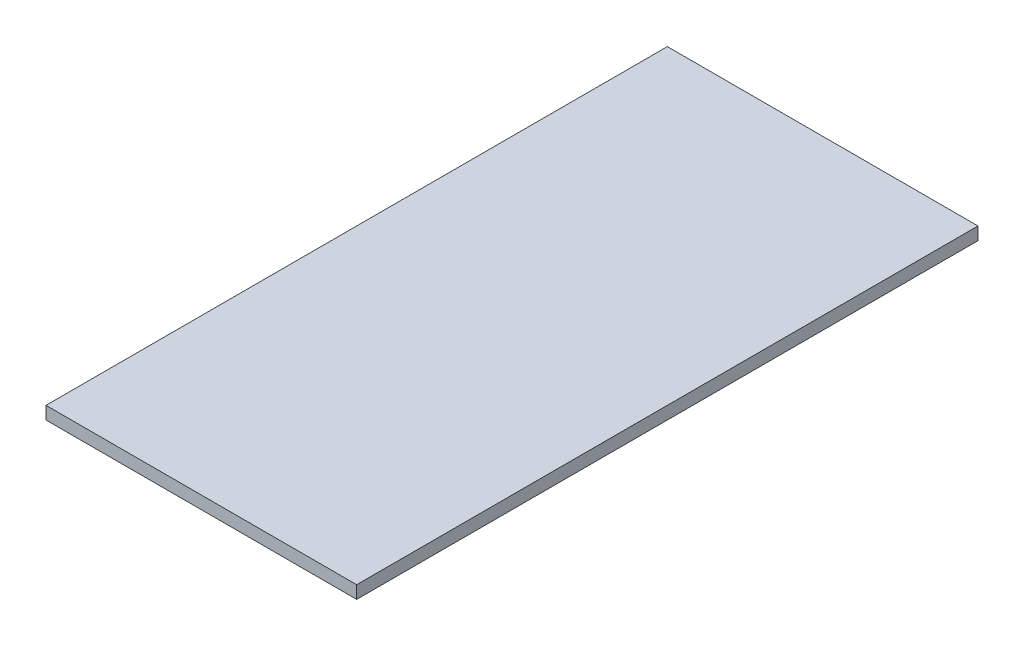
ISO-10303-21;
HEADER;
FILE_DESCRIPTION(('STEP AP214'),'2;1');
FILE_NAME('part.step','',(''),(''),'','','');
FILE_SCHEMA(('AUTOMOTIVE_DESIGN { 1 0 10303 214 1 1 1 1 }'));
ENDSEC;
DATA;
#1=APPLICATION_CONTEXT('core data for automotive mechanical design processes');
#2=APPLICATION_PROTOCOL_DEFINITION('international standard','automotive_design',2000,#1);
#3=PRODUCT_CONTEXT('',#1,'mechanical');
#4=PRODUCT('Part','Part','',(#3));
#5=PRODUCT_RELATED_PRODUCT_CATEGORY('part','',(#4));
#6=PRODUCT_DEFINITION_FORMATION('','',#4);
#7=PRODUCT_DEFINITION_CONTEXT('part definition',#1,'design');
#8=PRODUCT_DEFINITION('design','',#6,#7);
#9=PRODUCT_DEFINITION_SHAPE('','',#8);
#10=(LENGTH_UNIT() NAMED_UNIT(*) SI_UNIT(.MILLI.,.METRE.));
#11=(NAMED_UNIT(*) PLANE_ANGLE_UNIT() SI_UNIT($,.RADIAN.));
#12=(NAMED_UNIT(*) SI_UNIT($,.STERADIAN.) SOLID_ANGLE_UNIT());
#13=UNCERTAINTY_MEASURE_WITH_UNIT(LENGTH_MEASURE(1.E-05),#10,'distance_accuracy_value','');
#14=(GEOMETRIC_REPRESENTATION_CONTEXT(3) GLOBAL_UNCERTAINTY_ASSIGNED_CONTEXT((#13)) GLOBAL_UNIT_ASSIGNED_CONTEXT((#10,
#11,#12)) REPRESENTATION_CONTEXT('',''));
#15=CARTESIAN_POINT('',(0.,0.,0.));
#16=DIRECTION('',(0.,0.,1.));
#17=DIRECTION('',(1.,0.,0.));
#18=AXIS2_PLACEMENT_3D('',#15,#16,#17);
#19=CARTESIAN_POINT('',(-1219.2,100.,2438.4));
#20=DIRECTION('',(1.,0.,0.));
#21=DIRECTION('',(0.,0.,-1.));
#22=AXIS2_PLACEMENT_3D('',#19,#20,#21);
#23=PLANE('',#22);
#24=DIRECTION('',(0.,0.,1.));
#25=VECTOR('',#24,1.);
#26=CARTESIAN_POINT('',(-1219.2,0.,2438.4));
#27=LINE('',#26,#25);
#28=CARTESIAN_POINT('',(-1219.2,0.,-2438.4));
#29=VERTEX_POINT('',#28);
#30=CARTESIAN_POINT('',(-1219.2,0.,2438.4));
#31=VERTEX_POINT('',#30);
#32=EDGE_CURVE('E95',#29,#31,#27,.T.);
#33=ORIENTED_EDGE('',*,*,#32,.T.);
#34=DIRECTION('',(0.,-1.,0.));
#35=VECTOR('',#34,1.);
#36=CARTESIAN_POINT('',(-1219.2,100.,2438.4));
#37=LINE('',#36,#35);
#38=CARTESIAN_POINT('',(-1219.2,100.,2438.4));
#39=VERTEX_POINT('',#38);
#40=EDGE_CURVE('E11',#39,#31,#37,.T.);
#41=ORIENTED_EDGE('',*,*,#40,.F.);
#42=DIRECTION('',(0.,0.,1.));
#43=VECTOR('',#42,1.);
#44=CARTESIAN_POINT('',(-1219.2,100.,2438.4));
#45=LINE('',#44,#43);
#46=CARTESIAN_POINT('',(-1219.2,100.,-2438.4));
#47=VERTEX_POINT('',#46);
#48=EDGE_CURVE('E83',#47,#39,#45,.T.);
#49=ORIENTED_EDGE('',*,*,#48,.F.);
#50=DIRECTION('',(0.,-1.,0.));
#51=VECTOR('',#50,1.);
#52=CARTESIAN_POINT('',(-1219.2,100.,-2438.4));
#53=LINE('',#52,#51);
#54=EDGE_CURVE('E91',#47,#29,#53,.T.);
#55=ORIENTED_EDGE('',*,*,#54,.T.);
#56=EDGE_LOOP('',(#33,#41,#49,#55));
#57=FACE_BOUND('',#56,.T.);
#58=ADVANCED_FACE('F32',(#57),#23,.F.);
#59=CARTESIAN_POINT('',(1219.2,100.,2438.4));
#60=DIRECTION('',(0.,0.,-1.));
#61=DIRECTION('',(-1.,0.,0.));
#62=AXIS2_PLACEMENT_3D('',#59,#60,#61);
#63=PLANE('',#62);
#64=DIRECTION('',(1.,0.,0.));
#65=VECTOR('',#64,1.);
#66=CARTESIAN_POINT('',(1219.2,0.,2438.4));
#67=LINE('',#66,#65);
#68=CARTESIAN_POINT('',(1219.2,0.,2438.4));
#69=VERTEX_POINT('',#68);
#70=EDGE_CURVE('E87',#31,#69,#67,.T.);
#71=ORIENTED_EDGE('',*,*,#70,.T.);
#72=DIRECTION('',(0.,-1.,0.));
#73=VECTOR('',#72,1.);
#74=CARTESIAN_POINT('',(1219.2,100.,2438.4));
#75=LINE('',#74,#73);
#76=CARTESIAN_POINT('',(1219.2,100.,2438.4));
#77=VERTEX_POINT('',#76);
#78=EDGE_CURVE('E40',#77,#69,#75,.T.);
#79=ORIENTED_EDGE('',*,*,#78,.F.);
#80=DIRECTION('',(1.,0.,0.));
#81=VECTOR('',#80,1.);
#82=CARTESIAN_POINT('',(1219.2,100.,2438.4));
#83=LINE('',#82,#81);
#84=EDGE_CURVE('E78',#39,#77,#83,.T.);
#85=ORIENTED_EDGE('',*,*,#84,.F.);
#86=ORIENTED_EDGE('',*,*,#40,.T.);
#87=EDGE_LOOP('',(#71,#79,#85,#86));
#88=FACE_BOUND('',#87,.T.);
#89=ADVANCED_FACE('F86',(#88),#63,.F.);
#90=CARTESIAN_POINT('',(1219.2,100.,2438.4));
#91=DIRECTION('',(-1.,0.,0.));
#92=DIRECTION('',(0.,0.,1.));
#93=AXIS2_PLACEMENT_3D('',#90,#91,#92);
#94=PLANE('',#93);
#95=DIRECTION('',(0.,0.,-1.));
#96=VECTOR('',#95,1.);
#97=CARTESIAN_POINT('',(1219.2,0.,2438.4));
#98=LINE('',#97,#96);
#99=CARTESIAN_POINT('',(1219.2,0.,-2438.4));
#100=VERTEX_POINT('',#99);
#101=EDGE_CURVE('E65',#69,#100,#98,.T.);
#102=ORIENTED_EDGE('',*,*,#101,.T.);
#103=DIRECTION('',(0.,-1.,0.));
#104=VECTOR('',#103,1.);
#105=CARTESIAN_POINT('',(1219.2,100.,-2438.4));
#106=LINE('',#105,#104);
#107=CARTESIAN_POINT('',(1219.2,100.,-2438.4));
#108=VERTEX_POINT('',#107);
#109=EDGE_CURVE('E88',#108,#100,#106,.T.);
#110=ORIENTED_EDGE('',*,*,#109,.F.);
#111=DIRECTION('',(0.,0.,-1.));
#112=VECTOR('',#111,1.);
#113=CARTESIAN_POINT('',(1219.2,100.,2438.4));
#114=LINE('',#113,#112);
#115=EDGE_CURVE('E81',#77,#108,#114,.T.);
#116=ORIENTED_EDGE('',*,*,#115,.F.);
#117=ORIENTED_EDGE('',*,*,#78,.T.);
#118=EDGE_LOOP('',(#102,#110,#116,#117));
#119=FACE_BOUND('',#118,.T.);
#120=ADVANCED_FACE('F89',(#119),#94,.F.);
#121=CARTESIAN_POINT('',(1219.2,100.,-2438.4));
#122=DIRECTION('',(0.,0.,1.));
#123=DIRECTION('',(1.,0.,0.));
#124=AXIS2_PLACEMENT_3D('',#121,#122,#123);
#125=PLANE('',#124);
#126=DIRECTION('',(-1.,0.,0.));
#127=VECTOR('',#126,1.);
#128=CARTESIAN_POINT('',(1219.2,0.,-2438.4));
#129=LINE('',#128,#127);
#130=EDGE_CURVE('E71',#100,#29,#129,.T.);
#131=ORIENTED_EDGE('',*,*,#130,.T.);
#132=ORIENTED_EDGE('',*,*,#54,.F.);
#133=DIRECTION('',(-1.,0.,0.));
#134=VECTOR('',#133,1.);
#135=CARTESIAN_POINT('',(1219.2,100.,-2438.4));
#136=LINE('',#135,#134);
#137=EDGE_CURVE('E48',#108,#47,#136,.T.);
#138=ORIENTED_EDGE('',*,*,#137,.F.);
#139=ORIENTED_EDGE('',*,*,#109,.T.);
#140=EDGE_LOOP('',(#131,#132,#138,#139));
#141=FACE_BOUND('',#140,.T.);
#142=ADVANCED_FACE('F102',(#141),#125,.F.);
#143=CARTESIAN_POINT('',(0.,100.,0.));
#144=DIRECTION('',(0.,1.,0.));
#145=DIRECTION('',(0.,0.,1.));
#146=AXIS2_PLACEMENT_3D('',#143,#144,#145);
#147=PLANE('',#146);
#148=ORIENTED_EDGE('',*,*,#48,.T.);
#149=ORIENTED_EDGE('',*,*,#84,.T.);
#150=ORIENTED_EDGE('',*,*,#115,.T.);
#151=ORIENTED_EDGE('',*,*,#137,.T.);
#152=EDGE_LOOP('',(#148,#149,#150,#151));
#153=FACE_BOUND('',#152,.T.);
#154=ADVANCED_FACE('F79',(#153),#147,.T.);
#155=CARTESIAN_POINT('',(0.,0.,0.));
#156=DIRECTION('',(0.,1.,0.));
#157=DIRECTION('',(0.,0.,1.));
#158=AXIS2_PLACEMENT_3D('',#155,#156,#157);
#159=PLANE('',#158);
#160=ORIENTED_EDGE('',*,*,#32,.F.);
#161=ORIENTED_EDGE('',*,*,#130,.F.);
#162=ORIENTED_EDGE('',*,*,#101,.F.);
#163=ORIENTED_EDGE('',*,*,#70,.F.);
#164=EDGE_LOOP('',(#160,#161,#162,#163));
#165=FACE_BOUND('',#164,.T.);
#166=ADVANCED_FACE('F105',(#165),#159,.F.);
#167=CLOSED_SHELL('',(#58,#89,#120,#142,#154,#166));
#168=MANIFOLD_SOLID_BREP('B2',#167);
#169=ADVANCED_BREP_SHAPE_REPRESENTATION('',(#18,#168),#14);
#170=SHAPE_DEFINITION_REPRESENTATION(#9,#169);
ENDSEC;
END-ISO-10303-21;
